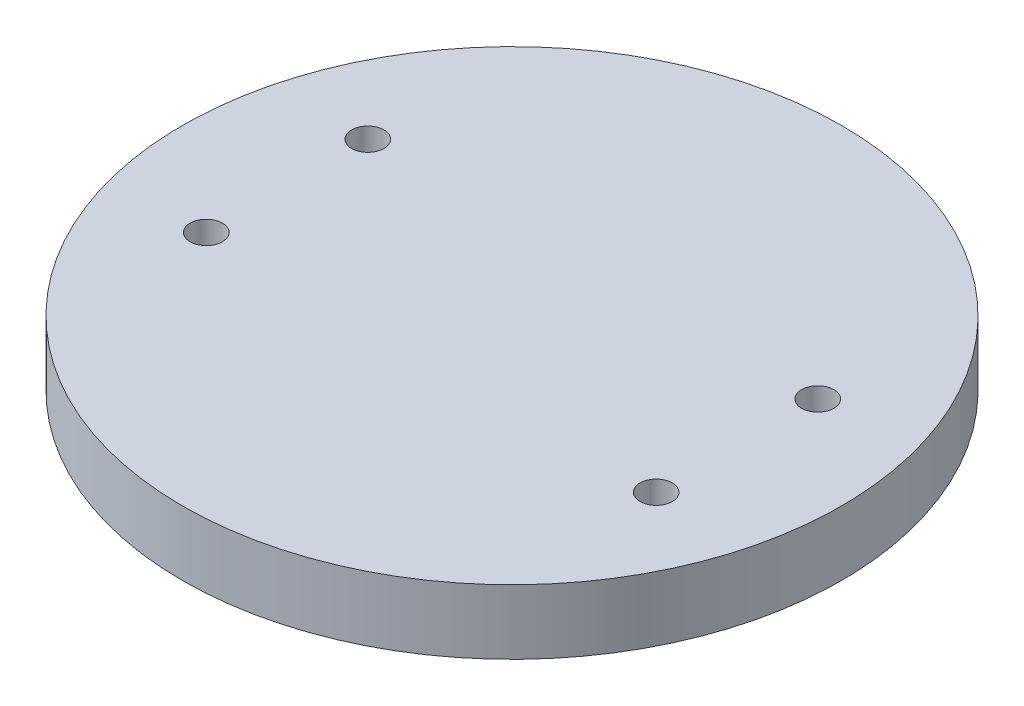
ISO-10303-21;
HEADER;
FILE_DESCRIPTION(('STEP AP214'),'2;1');
FILE_NAME('part.step','',(''),(''),'','','');
FILE_SCHEMA(('AUTOMOTIVE_DESIGN { 1 0 10303 214 1 1 1 1 }'));
ENDSEC;
DATA;
#1=APPLICATION_CONTEXT('core data for automotive mechanical design processes');
#2=APPLICATION_PROTOCOL_DEFINITION('international standard','automotive_design',2000,#1);
#3=PRODUCT_CONTEXT('',#1,'mechanical');
#4=PRODUCT('Part','Part','',(#3));
#5=PRODUCT_RELATED_PRODUCT_CATEGORY('part','',(#4));
#6=PRODUCT_DEFINITION_FORMATION('','',#4);
#7=PRODUCT_DEFINITION_CONTEXT('part definition',#1,'design');
#8=PRODUCT_DEFINITION('design','',#6,#7);
#9=PRODUCT_DEFINITION_SHAPE('','',#8);
#10=(LENGTH_UNIT() NAMED_UNIT(*) SI_UNIT(.MILLI.,.METRE.));
#11=(NAMED_UNIT(*) PLANE_ANGLE_UNIT() SI_UNIT($,.RADIAN.));
#12=(NAMED_UNIT(*) SI_UNIT($,.STERADIAN.) SOLID_ANGLE_UNIT());
#13=UNCERTAINTY_MEASURE_WITH_UNIT(LENGTH_MEASURE(1.E-05),#10,'distance_accuracy_value','');
#14=(GEOMETRIC_REPRESENTATION_CONTEXT(3) GLOBAL_UNCERTAINTY_ASSIGNED_CONTEXT((#13)) GLOBAL_UNIT_ASSIGNED_CONTEXT((#10,
#11,#12)) REPRESENTATION_CONTEXT('',''));
#15=CARTESIAN_POINT('',(0.,0.,0.));
#16=DIRECTION('',(0.,0.,1.));
#17=DIRECTION('',(1.,0.,0.));
#18=AXIS2_PLACEMENT_3D('',#15,#16,#17);
#19=CARTESIAN_POINT('',(0.,12.7,0.));
#20=DIRECTION('',(0.,-1.,0.));
#21=DIRECTION('',(0.,0.,-1.));
#22=AXIS2_PLACEMENT_3D('',#19,#20,#21);
#23=CYLINDRICAL_SURFACE('',#22,64.77);
#24=CARTESIAN_POINT('',(0.,12.7,0.));
#25=DIRECTION('',(0.,1.,0.));
#26=DIRECTION('',(0.,0.,1.));
#27=AXIS2_PLACEMENT_3D('',#24,#25,#26);
#28=CIRCLE('',#27,64.77);
#29=CARTESIAN_POINT('',(0.,12.7,64.77));
#30=VERTEX_POINT('',#29);
#31=EDGE_CURVE('E10',#30,#30,#28,.T.);
#32=ORIENTED_EDGE('',*,*,#31,.F.);
#33=EDGE_LOOP('',(#32));
#34=FACE_BOUND('',#33,.T.);
#35=CARTESIAN_POINT('',(0.,0.,0.));
#36=DIRECTION('',(0.,1.,0.));
#37=DIRECTION('',(0.,0.,1.));
#38=AXIS2_PLACEMENT_3D('',#35,#36,#37);
#39=CIRCLE('',#38,64.77);
#40=CARTESIAN_POINT('',(0.,0.,64.77));
#41=VERTEX_POINT('',#40);
#42=EDGE_CURVE('E33',#41,#41,#39,.T.);
#43=ORIENTED_EDGE('',*,*,#42,.T.);
#44=EDGE_LOOP('',(#43));
#45=FACE_BOUND('',#44,.T.);
#46=ADVANCED_FACE('F30',(#34,#45),#23,.T.);
#47=CARTESIAN_POINT('',(0.,12.7,0.));
#48=DIRECTION('',(0.,1.,0.));
#49=DIRECTION('',(0.,0.,1.));
#50=AXIS2_PLACEMENT_3D('',#47,#48,#49);
#51=PLANE('',#50);
#52=CARTESIAN_POINT('',(44.2148136214073,12.7,-15.875));
#53=DIRECTION('',(0.,1.,0.));
#54=DIRECTION('',(0.,0.,-1.));
#55=AXIS2_PLACEMENT_3D('',#52,#53,#54);
#56=CIRCLE('',#55,3.175);
#57=CARTESIAN_POINT('',(44.2148136214073,12.7,-19.05));
#58=VERTEX_POINT('',#57);
#59=EDGE_CURVE('E48',#58,#58,#56,.T.);
#60=ORIENTED_EDGE('',*,*,#59,.F.);
#61=EDGE_LOOP('',(#60));
#62=FACE_BOUND('',#61,.T.);
#63=CARTESIAN_POINT('',(44.2148136214073,12.7,15.8749999999999));
#64=DIRECTION('',(0.,1.,0.));
#65=DIRECTION('',(0.,0.,1.));
#66=AXIS2_PLACEMENT_3D('',#63,#64,#65);
#67=CIRCLE('',#66,3.175);
#68=CARTESIAN_POINT('',(44.2148136214073,12.7,19.0499999999999));
#69=VERTEX_POINT('',#68);
#70=EDGE_CURVE('E54',#69,#69,#67,.T.);
#71=ORIENTED_EDGE('',*,*,#70,.F.);
#72=EDGE_LOOP('',(#71));
#73=FACE_BOUND('',#72,.T.);
#74=CARTESIAN_POINT('',(-44.2148136214073,12.7,15.875));
#75=DIRECTION('',(0.,1.,0.));
#76=DIRECTION('',(0.,0.,-1.));
#77=AXIS2_PLACEMENT_3D('',#74,#75,#76);
#78=CIRCLE('',#77,3.175);
#79=CARTESIAN_POINT('',(-44.2148136214073,12.7,12.7));
#80=VERTEX_POINT('',#79);
#81=EDGE_CURVE('E60',#80,#80,#78,.T.);
#82=ORIENTED_EDGE('',*,*,#81,.F.);
#83=EDGE_LOOP('',(#82));
#84=FACE_BOUND('',#83,.T.);
#85=CARTESIAN_POINT('',(-44.2148136214073,12.7,-15.875));
#86=DIRECTION('',(0.,1.,0.));
#87=DIRECTION('',(0.,0.,1.));
#88=AXIS2_PLACEMENT_3D('',#85,#86,#87);
#89=CIRCLE('',#88,3.175);
#90=CARTESIAN_POINT('',(-44.2148136214073,12.7,-12.7));
#91=VERTEX_POINT('',#90);
#92=EDGE_CURVE('E42',#91,#91,#89,.T.);
#93=ORIENTED_EDGE('',*,*,#92,.F.);
#94=EDGE_LOOP('',(#93));
#95=FACE_BOUND('',#94,.T.);
#96=ORIENTED_EDGE('',*,*,#31,.T.);
#97=EDGE_LOOP('',(#96));
#98=FACE_BOUND('',#97,.T.);
#99=ADVANCED_FACE('F77',(#62,#73,#84,#95,#98),#51,.T.);
#100=CARTESIAN_POINT('',(0.,0.,0.));
#101=DIRECTION('',(0.,1.,0.));
#102=DIRECTION('',(0.,0.,1.));
#103=AXIS2_PLACEMENT_3D('',#100,#101,#102);
#104=PLANE('',#103);
#105=CARTESIAN_POINT('',(44.2148136214073,0.,-15.875));
#106=DIRECTION('',(0.,1.,0.));
#107=DIRECTION('',(0.,0.,-1.));
#108=AXIS2_PLACEMENT_3D('',#105,#106,#107);
#109=CIRCLE('',#108,3.175);
#110=CARTESIAN_POINT('',(44.2148136214073,0.,-19.05));
#111=VERTEX_POINT('',#110);
#112=EDGE_CURVE('E51',#111,#111,#109,.T.);
#113=ORIENTED_EDGE('',*,*,#112,.T.);
#114=EDGE_LOOP('',(#113));
#115=FACE_BOUND('',#114,.T.);
#116=CARTESIAN_POINT('',(44.2148136214073,0.,15.8749999999999));
#117=DIRECTION('',(0.,1.,0.));
#118=DIRECTION('',(0.,0.,1.));
#119=AXIS2_PLACEMENT_3D('',#116,#117,#118);
#120=CIRCLE('',#119,3.175);
#121=CARTESIAN_POINT('',(44.2148136214073,0.,19.0499999999999));
#122=VERTEX_POINT('',#121);
#123=EDGE_CURVE('E57',#122,#122,#120,.T.);
#124=ORIENTED_EDGE('',*,*,#123,.T.);
#125=EDGE_LOOP('',(#124));
#126=FACE_BOUND('',#125,.T.);
#127=CARTESIAN_POINT('',(-44.2148136214073,0.,15.875));
#128=DIRECTION('',(0.,1.,0.));
#129=DIRECTION('',(0.,0.,-1.));
#130=AXIS2_PLACEMENT_3D('',#127,#128,#129);
#131=CIRCLE('',#130,3.175);
#132=CARTESIAN_POINT('',(-44.2148136214073,0.,12.7));
#133=VERTEX_POINT('',#132);
#134=EDGE_CURVE('E45',#133,#133,#131,.T.);
#135=ORIENTED_EDGE('',*,*,#134,.T.);
#136=EDGE_LOOP('',(#135));
#137=FACE_BOUND('',#136,.T.);
#138=CARTESIAN_POINT('',(-44.2148136214073,0.,-15.875));
#139=DIRECTION('',(0.,1.,0.));
#140=DIRECTION('',(0.,0.,1.));
#141=AXIS2_PLACEMENT_3D('',#138,#139,#140);
#142=CIRCLE('',#141,3.175);
#143=CARTESIAN_POINT('',(-44.2148136214073,0.,-12.7));
#144=VERTEX_POINT('',#143);
#145=EDGE_CURVE('E40',#144,#144,#142,.T.);
#146=ORIENTED_EDGE('',*,*,#145,.T.);
#147=EDGE_LOOP('',(#146));
#148=FACE_BOUND('',#147,.T.);
#149=ORIENTED_EDGE('',*,*,#42,.F.);
#150=EDGE_LOOP('',(#149));
#151=FACE_BOUND('',#150,.T.);
#152=ADVANCED_FACE('F66',(#115,#126,#137,#148,#151),#104,.F.);
#153=CARTESIAN_POINT('',(-44.2148136214073,0.,-15.875));
#154=DIRECTION('',(0.,1.,0.));
#155=DIRECTION('',(0.,0.,1.));
#156=AXIS2_PLACEMENT_3D('',#153,#154,#155);
#157=CYLINDRICAL_SURFACE('',#156,3.175);
#158=ORIENTED_EDGE('',*,*,#145,.F.);
#159=EDGE_LOOP('',(#158));
#160=FACE_BOUND('',#159,.T.);
#161=ORIENTED_EDGE('',*,*,#92,.T.);
#162=EDGE_LOOP('',(#161));
#163=FACE_BOUND('',#162,.T.);
#164=ADVANCED_FACE('F73',(#160,#163),#157,.F.);
#165=CARTESIAN_POINT('',(-44.2148136214073,0.,15.875));
#166=DIRECTION('',(0.,1.,0.));
#167=DIRECTION('',(0.,0.,1.));
#168=AXIS2_PLACEMENT_3D('',#165,#166,#167);
#169=CYLINDRICAL_SURFACE('',#168,3.175);
#170=ORIENTED_EDGE('',*,*,#134,.F.);
#171=EDGE_LOOP('',(#170));
#172=FACE_BOUND('',#171,.T.);
#173=ORIENTED_EDGE('',*,*,#81,.T.);
#174=EDGE_LOOP('',(#173));
#175=FACE_BOUND('',#174,.T.);
#176=ADVANCED_FACE('F69',(#172,#175),#169,.F.);
#177=CARTESIAN_POINT('',(44.2148136214073,0.,15.8749999999999));
#178=DIRECTION('',(0.,1.,0.));
#179=DIRECTION('',(0.,0.,1.));
#180=AXIS2_PLACEMENT_3D('',#177,#178,#179);
#181=CYLINDRICAL_SURFACE('',#180,3.175);
#182=ORIENTED_EDGE('',*,*,#123,.F.);
#183=EDGE_LOOP('',(#182));
#184=FACE_BOUND('',#183,.T.);
#185=ORIENTED_EDGE('',*,*,#70,.T.);
#186=EDGE_LOOP('',(#185));
#187=FACE_BOUND('',#186,.T.);
#188=ADVANCED_FACE('F72',(#184,#187),#181,.F.);
#189=CARTESIAN_POINT('',(44.2148136214073,0.,-15.875));
#190=DIRECTION('',(0.,1.,0.));
#191=DIRECTION('',(0.,0.,1.));
#192=AXIS2_PLACEMENT_3D('',#189,#190,#191);
#193=CYLINDRICAL_SURFACE('',#192,3.175);
#194=ORIENTED_EDGE('',*,*,#112,.F.);
#195=EDGE_LOOP('',(#194));
#196=FACE_BOUND('',#195,.T.);
#197=ORIENTED_EDGE('',*,*,#59,.T.);
#198=EDGE_LOOP('',(#197));
#199=FACE_BOUND('',#198,.T.);
#200=ADVANCED_FACE('F127',(#196,#199),#193,.F.);
#201=CLOSED_SHELL('',(#46,#99,#152,#164,#176,#188,#200));
#202=MANIFOLD_SOLID_BREP('B2',#201);
#203=ADVANCED_BREP_SHAPE_REPRESENTATION('',(#18,#202),#14);
#204=SHAPE_DEFINITION_REPRESENTATION(#9,#203);
ENDSEC;
END-ISO-10303-21;
